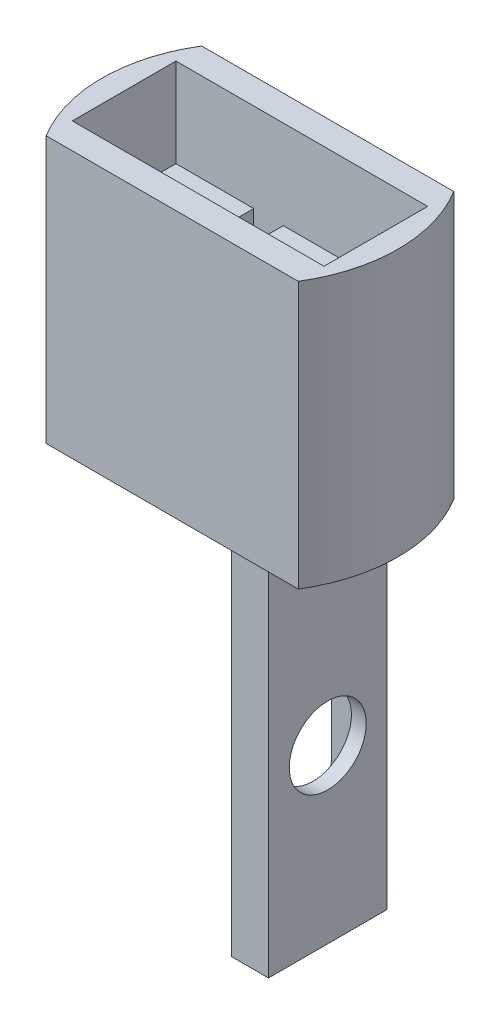
ISO-10303-21;
HEADER;
FILE_DESCRIPTION(('STEP AP214'),'2;1');
FILE_NAME('part.step','',(''),(''),'','','');
FILE_SCHEMA(('AUTOMOTIVE_DESIGN { 1 0 10303 214 1 1 1 1 }'));
ENDSEC;
DATA;
#1=APPLICATION_CONTEXT('core data for automotive mechanical design processes');
#2=APPLICATION_PROTOCOL_DEFINITION('international standard','automotive_design',2000,#1);
#3=PRODUCT_CONTEXT('',#1,'mechanical');
#4=PRODUCT('Part','Part','',(#3));
#5=PRODUCT_RELATED_PRODUCT_CATEGORY('part','',(#4));
#6=PRODUCT_DEFINITION_FORMATION('','',#4);
#7=PRODUCT_DEFINITION_CONTEXT('part definition',#1,'design');
#8=PRODUCT_DEFINITION('design','',#6,#7);
#9=PRODUCT_DEFINITION_SHAPE('','',#8);
#10=(LENGTH_UNIT() NAMED_UNIT(*) SI_UNIT(.MILLI.,.METRE.));
#11=(NAMED_UNIT(*) PLANE_ANGLE_UNIT() SI_UNIT($,.RADIAN.));
#12=(NAMED_UNIT(*) SI_UNIT($,.STERADIAN.) SOLID_ANGLE_UNIT());
#13=UNCERTAINTY_MEASURE_WITH_UNIT(LENGTH_MEASURE(1.E-05),#10,'distance_accuracy_value','');
#14=(GEOMETRIC_REPRESENTATION_CONTEXT(3) GLOBAL_UNCERTAINTY_ASSIGNED_CONTEXT((#13)) GLOBAL_UNIT_ASSIGNED_CONTEXT((#10,
#11,#12)) REPRESENTATION_CONTEXT('',''));
#15=CARTESIAN_POINT('',(0.,0.,0.));
#16=DIRECTION('',(0.,0.,1.));
#17=DIRECTION('',(1.,0.,0.));
#18=AXIS2_PLACEMENT_3D('',#15,#16,#17);
#19=CARTESIAN_POINT('',(0.,18.,0.));
#20=DIRECTION('',(0.,-1.,0.));
#21=DIRECTION('',(0.,0.,-1.));
#22=AXIS2_PLACEMENT_3D('',#19,#20,#21);
#23=CYLINDRICAL_SURFACE('',#22,10.);
#24=CARTESIAN_POINT('',(0.,18.,0.));
#25=DIRECTION('',(0.,1.,0.));
#26=DIRECTION('',(0.,0.,1.));
#27=AXIS2_PLACEMENT_3D('',#24,#25,#26);
#28=CIRCLE('',#27,10.);
#29=CARTESIAN_POINT('',(-8.5110222652746,18.,-5.25));
#30=VERTEX_POINT('',#29);
#31=CARTESIAN_POINT('',(-8.5110222652746,18.,5.25));
#32=VERTEX_POINT('',#31);
#33=EDGE_CURVE('E49',#30,#32,#28,.T.);
#34=ORIENTED_EDGE('',*,*,#33,.F.);
#35=DIRECTION('',(0.,-1.,0.));
#36=VECTOR('',#35,1.);
#37=CARTESIAN_POINT('',(-8.5110222652746,18.001,-5.25));
#38=LINE('',#37,#36);
#39=CARTESIAN_POINT('',(-8.5110222652746,0.,-5.25));
#40=VERTEX_POINT('',#39);
#41=EDGE_CURVE('E57',#30,#40,#38,.T.);
#42=ORIENTED_EDGE('',*,*,#41,.T.);
#43=CARTESIAN_POINT('',(0.,0.,0.));
#44=DIRECTION('',(0.,1.,0.));
#45=DIRECTION('',(0.,0.,1.));
#46=AXIS2_PLACEMENT_3D('',#43,#44,#45);
#47=CIRCLE('',#46,10.);
#48=CARTESIAN_POINT('',(-8.5110222652746,0.,5.25));
#49=VERTEX_POINT('',#48);
#50=EDGE_CURVE('E449',#40,#49,#47,.T.);
#51=ORIENTED_EDGE('',*,*,#50,.T.);
#52=DIRECTION('',(0.,-1.,0.));
#53=VECTOR('',#52,1.);
#54=CARTESIAN_POINT('',(-8.5110222652746,18.001,5.25));
#55=LINE('',#54,#53);
#56=EDGE_CURVE('E228',#32,#49,#55,.T.);
#57=ORIENTED_EDGE('',*,*,#56,.F.);
#58=EDGE_LOOP('',(#34,#42,#51,#57));
#59=FACE_BOUND('',#58,.T.);
#60=ADVANCED_FACE('F39',(#59),#23,.T.);
#61=CARTESIAN_POINT('',(4.25,0.,0.));
#62=DIRECTION('',(1.,0.,0.));
#63=DIRECTION('',(0.,0.,-1.));
#64=AXIS2_PLACEMENT_3D('',#61,#62,#63);
#65=PLANE('',#64);
#66=CARTESIAN_POINT('',(4.25,-13.4,0.));
#67=DIRECTION('',(1.,0.,0.));
#68=DIRECTION('',(0.,0.,-1.));
#69=AXIS2_PLACEMENT_3D('',#66,#67,#68);
#70=CIRCLE('',#69,2.6);
#71=CARTESIAN_POINT('',(4.25,-13.4,-2.6));
#72=VERTEX_POINT('',#71);
#73=EDGE_CURVE('E43',#72,#72,#70,.F.);
#74=ORIENTED_EDGE('',*,*,#73,.F.);
#75=EDGE_LOOP('',(#74));
#76=FACE_BOUND('',#75,.T.);
#77=DIRECTION('',(0.,0.984427575508482,0.175790638483658));
#78=VECTOR('',#77,1.);
#79=CARTESIAN_POINT('',(4.25,-9.9,-2.75));
#80=LINE('',#79,#78);
#81=CARTESIAN_POINT('',(4.25,-9.89999999999999,-2.75));
#82=VERTEX_POINT('',#81);
#83=CARTESIAN_POINT('',(4.25,-2.9,-1.5));
#84=VERTEX_POINT('',#83);
#85=EDGE_CURVE('E209',#82,#84,#80,.T.);
#86=ORIENTED_EDGE('',*,*,#85,.F.);
#87=DIRECTION('',(0.,-1.,0.));
#88=VECTOR('',#87,1.);
#89=CARTESIAN_POINT('',(4.25,-23.9,-2.75));
#90=LINE('',#89,#88);
#91=CARTESIAN_POINT('',(4.25,-16.9,-2.75));
#92=VERTEX_POINT('',#91);
#93=EDGE_CURVE('E384',#82,#92,#90,.T.);
#94=ORIENTED_EDGE('',*,*,#93,.T.);
#95=DIRECTION('',(0.,0.984427575508482,-0.175790638483658));
#96=VECTOR('',#95,1.);
#97=CARTESIAN_POINT('',(4.25,-16.9,-2.75));
#98=LINE('',#97,#96);
#99=CARTESIAN_POINT('',(4.25,-23.9,-1.5));
#100=VERTEX_POINT('',#99);
#101=EDGE_CURVE('E266',#100,#92,#98,.T.);
#102=ORIENTED_EDGE('',*,*,#101,.F.);
#103=DIRECTION('',(0.,0.,1.));
#104=VECTOR('',#103,1.);
#105=CARTESIAN_POINT('',(4.25,-23.9,-2.75));
#106=LINE('',#105,#104);
#107=CARTESIAN_POINT('',(4.25,-23.9,1.5));
#108=VERTEX_POINT('',#107);
#109=EDGE_CURVE('E387',#100,#108,#106,.T.);
#110=ORIENTED_EDGE('',*,*,#109,.T.);
#111=DIRECTION('',(0.,-0.984427575508482,-0.175790638483658));
#112=VECTOR('',#111,1.);
#113=CARTESIAN_POINT('',(4.25,-16.9,2.75));
#114=LINE('',#113,#112);
#115=CARTESIAN_POINT('',(4.25,-16.9,2.75));
#116=VERTEX_POINT('',#115);
#117=EDGE_CURVE('E251',#116,#108,#114,.T.);
#118=ORIENTED_EDGE('',*,*,#117,.F.);
#119=DIRECTION('',(0.,1.,0.));
#120=VECTOR('',#119,1.);
#121=CARTESIAN_POINT('',(4.25,-23.9,2.75));
#122=LINE('',#121,#120);
#123=CARTESIAN_POINT('',(4.25,-9.89999999999999,2.75));
#124=VERTEX_POINT('',#123);
#125=EDGE_CURVE('E375',#116,#124,#122,.T.);
#126=ORIENTED_EDGE('',*,*,#125,.T.);
#127=DIRECTION('',(0.,-0.984427575508482,0.175790638483658));
#128=VECTOR('',#127,1.);
#129=CARTESIAN_POINT('',(4.25,-9.9,2.75));
#130=LINE('',#129,#128);
#131=CARTESIAN_POINT('',(4.25,-2.9,1.5));
#132=VERTEX_POINT('',#131);
#133=EDGE_CURVE('E236',#132,#124,#130,.T.);
#134=ORIENTED_EDGE('',*,*,#133,.F.);
#135=DIRECTION('',(0.,0.,-1.));
#136=VECTOR('',#135,1.);
#137=CARTESIAN_POINT('',(4.25,-2.9,-2.75));
#138=LINE('',#137,#136);
#139=EDGE_CURVE('E379',#132,#84,#138,.T.);
#140=ORIENTED_EDGE('',*,*,#139,.T.);
#141=EDGE_LOOP('',(#86,#94,#102,#110,#118,#126,#134,#140));
#142=FACE_BOUND('',#141,.T.);
#143=ADVANCED_FACE('F475',(#76,#142),#65,.F.);
#144=CARTESIAN_POINT('',(4.25,-2.9,-2.75));
#145=DIRECTION('',(0.,1.,0.));
#146=DIRECTION('',(0.,0.,1.));
#147=AXIS2_PLACEMENT_3D('',#144,#145,#146);
#148=PLANE('',#147);
#149=DIRECTION('',(1.,0.,0.));
#150=VECTOR('',#149,1.);
#151=CARTESIAN_POINT('',(-4.36073132666395,-2.9,-1.5));
#152=LINE('',#151,#150);
#153=CARTESIAN_POINT('',(2.75,-2.9,-1.5));
#154=VERTEX_POINT('',#153);
#155=EDGE_CURVE('E237',#154,#84,#152,.T.);
#156=ORIENTED_EDGE('',*,*,#155,.T.);
#157=ORIENTED_EDGE('',*,*,#139,.F.);
#158=DIRECTION('',(1.,0.,0.));
#159=VECTOR('',#158,1.);
#160=CARTESIAN_POINT('',(-4.36073132666395,-2.9,1.5));
#161=LINE('',#160,#159);
#162=CARTESIAN_POINT('',(2.75,-2.9,1.5));
#163=VERTEX_POINT('',#162);
#164=EDGE_CURVE('E252',#163,#132,#161,.T.);
#165=ORIENTED_EDGE('',*,*,#164,.F.);
#166=DIRECTION('',(0.,0.,-1.));
#167=VECTOR('',#166,1.);
#168=CARTESIAN_POINT('',(2.75,-2.9,-2.75));
#169=LINE('',#168,#167);
#170=EDGE_CURVE('E393',#163,#154,#169,.T.);
#171=ORIENTED_EDGE('',*,*,#170,.T.);
#172=EDGE_LOOP('',(#156,#157,#165,#171));
#173=FACE_BOUND('',#172,.T.);
#174=ADVANCED_FACE('F478',(#173),#148,.F.);
#175=CARTESIAN_POINT('',(4.25,-23.9,-2.75));
#176=DIRECTION('',(0.,0.,-1.));
#177=DIRECTION('',(-1.,0.,0.));
#178=AXIS2_PLACEMENT_3D('',#175,#176,#177);
#179=PLANE('',#178);
#180=DIRECTION('',(1.,0.,0.));
#181=VECTOR('',#180,1.);
#182=CARTESIAN_POINT('',(-4.36073132666394,-9.9,-2.75));
#183=LINE('',#182,#181);
#184=CARTESIAN_POINT('',(2.75,-9.89999999999999,-2.75));
#185=VERTEX_POINT('',#184);
#186=EDGE_CURVE('E241',#185,#82,#183,.T.);
#187=ORIENTED_EDGE('',*,*,#186,.F.);
#188=DIRECTION('',(0.,-1.,0.));
#189=VECTOR('',#188,1.);
#190=CARTESIAN_POINT('',(2.75,-23.9,-2.75));
#191=LINE('',#190,#189);
#192=CARTESIAN_POINT('',(2.75,-16.9,-2.75));
#193=VERTEX_POINT('',#192);
#194=EDGE_CURVE('E396',#185,#193,#191,.T.);
#195=ORIENTED_EDGE('',*,*,#194,.T.);
#196=DIRECTION('',(1.,0.,0.));
#197=VECTOR('',#196,1.);
#198=CARTESIAN_POINT('',(-4.36073132666394,-16.9,-2.75));
#199=LINE('',#198,#197);
#200=EDGE_CURVE('E286',#193,#92,#199,.T.);
#201=ORIENTED_EDGE('',*,*,#200,.T.);
#202=ORIENTED_EDGE('',*,*,#93,.F.);
#203=EDGE_LOOP('',(#187,#195,#201,#202));
#204=FACE_BOUND('',#203,.T.);
#205=ADVANCED_FACE('F485',(#204),#179,.F.);
#206=CARTESIAN_POINT('',(4.25,-23.9,2.75));
#207=DIRECTION('',(0.,0.,1.));
#208=DIRECTION('',(1.,0.,0.));
#209=AXIS2_PLACEMENT_3D('',#206,#207,#208);
#210=PLANE('',#209);
#211=DIRECTION('',(1.,0.,0.));
#212=VECTOR('',#211,1.);
#213=CARTESIAN_POINT('',(-4.36073132666395,-9.9,2.75));
#214=LINE('',#213,#212);
#215=CARTESIAN_POINT('',(2.75,-9.89999999999998,2.75));
#216=VERTEX_POINT('',#215);
#217=EDGE_CURVE('E256',#216,#124,#214,.T.);
#218=ORIENTED_EDGE('',*,*,#217,.T.);
#219=ORIENTED_EDGE('',*,*,#125,.F.);
#220=DIRECTION('',(1.,0.,0.));
#221=VECTOR('',#220,1.);
#222=CARTESIAN_POINT('',(-4.36073132666395,-16.9,2.75));
#223=LINE('',#222,#221);
#224=CARTESIAN_POINT('',(2.75,-16.9,2.75));
#225=VERTEX_POINT('',#224);
#226=EDGE_CURVE('E271',#225,#116,#223,.T.);
#227=ORIENTED_EDGE('',*,*,#226,.F.);
#228=DIRECTION('',(0.,1.,0.));
#229=VECTOR('',#228,1.);
#230=CARTESIAN_POINT('',(2.75,-23.9,2.75));
#231=LINE('',#230,#229);
#232=EDGE_CURVE('E365',#225,#216,#231,.T.);
#233=ORIENTED_EDGE('',*,*,#232,.T.);
#234=EDGE_LOOP('',(#218,#219,#227,#233));
#235=FACE_BOUND('',#234,.T.);
#236=ADVANCED_FACE('F509',(#235),#210,.F.);
#237=CARTESIAN_POINT('',(4.25,-23.9,-2.75));
#238=DIRECTION('',(0.,-1.,0.));
#239=DIRECTION('',(0.,0.,-1.));
#240=AXIS2_PLACEMENT_3D('',#237,#238,#239);
#241=PLANE('',#240);
#242=DIRECTION('',(1.,0.,0.));
#243=VECTOR('',#242,1.);
#244=CARTESIAN_POINT('',(-4.36073132666395,-23.9,1.5));
#245=LINE('',#244,#243);
#246=CARTESIAN_POINT('',(2.75,-23.9,1.5));
#247=VERTEX_POINT('',#246);
#248=EDGE_CURVE('E267',#247,#108,#245,.T.);
#249=ORIENTED_EDGE('',*,*,#248,.T.);
#250=ORIENTED_EDGE('',*,*,#109,.F.);
#251=DIRECTION('',(1.,0.,0.));
#252=VECTOR('',#251,1.);
#253=CARTESIAN_POINT('',(-4.36073132666395,-23.9,-1.5));
#254=LINE('',#253,#252);
#255=CARTESIAN_POINT('',(2.75,-23.9,-1.5));
#256=VERTEX_POINT('',#255);
#257=EDGE_CURVE('E282',#256,#100,#254,.T.);
#258=ORIENTED_EDGE('',*,*,#257,.F.);
#259=DIRECTION('',(0.,0.,1.));
#260=VECTOR('',#259,1.);
#261=CARTESIAN_POINT('',(2.75,-23.9,-2.75));
#262=LINE('',#261,#260);
#263=EDGE_CURVE('E380',#256,#247,#262,.T.);
#264=ORIENTED_EDGE('',*,*,#263,.T.);
#265=EDGE_LOOP('',(#249,#250,#258,#264));
#266=FACE_BOUND('',#265,.T.);
#267=ADVANCED_FACE('F502',(#266),#241,.F.);
#268=CARTESIAN_POINT('',(0.,12.,0.));
#269=DIRECTION('',(0.,-1.,0.));
#270=DIRECTION('',(0.,0.,-1.));
#271=AXIS2_PLACEMENT_3D('',#268,#269,#270);
#272=PLANE('',#271);
#273=DIRECTION('',(0.,0.,-1.));
#274=VECTOR('',#273,1.);
#275=CARTESIAN_POINT('',(-1.25,12.,-3.5));
#276=LINE('',#275,#274);
#277=CARTESIAN_POINT('',(-1.25,12.,3.5));
#278=VERTEX_POINT('',#277);
#279=CARTESIAN_POINT('',(-1.25,12.,-3.5));
#280=VERTEX_POINT('',#279);
#281=EDGE_CURVE('E281',#278,#280,#276,.T.);
#282=ORIENTED_EDGE('',*,*,#281,.F.);
#283=DIRECTION('',(1.,0.,0.));
#284=VECTOR('',#283,1.);
#285=CARTESIAN_POINT('',(-8.5,12.,3.5));
#286=LINE('',#285,#284);
#287=CARTESIAN_POINT('',(8.5,12.,3.5));
#288=VERTEX_POINT('',#287);
#289=EDGE_CURVE('E333',#278,#288,#286,.T.);
#290=ORIENTED_EDGE('',*,*,#289,.T.);
#291=DIRECTION('',(0.,0.,-1.));
#292=VECTOR('',#291,1.);
#293=CARTESIAN_POINT('',(8.5,12.,3.5));
#294=LINE('',#293,#292);
#295=CARTESIAN_POINT('',(8.5,12.,-3.5));
#296=VERTEX_POINT('',#295);
#297=EDGE_CURVE('E339',#288,#296,#294,.T.);
#298=ORIENTED_EDGE('',*,*,#297,.T.);
#299=DIRECTION('',(-1.,0.,0.));
#300=VECTOR('',#299,1.);
#301=CARTESIAN_POINT('',(-8.5,12.,-3.5));
#302=LINE('',#301,#300);
#303=EDGE_CURVE('E344',#296,#280,#302,.T.);
#304=ORIENTED_EDGE('',*,*,#303,.T.);
#305=EDGE_LOOP('',(#282,#290,#298,#304));
#306=FACE_BOUND('',#305,.T.);
#307=ADVANCED_FACE('F535',(#306),#272,.F.);
#308=DIRECTION('',(0.,0.,1.));
#309=VECTOR('',#308,1.);
#310=CARTESIAN_POINT('',(-3.25,12.,-3.5));
#311=LINE('',#310,#309);
#312=CARTESIAN_POINT('',(-3.25,12.,-3.5));
#313=VERTEX_POINT('',#312);
#314=CARTESIAN_POINT('',(-3.25,12.,3.5));
#315=VERTEX_POINT('',#314);
#316=EDGE_CURVE('E298',#313,#315,#311,.T.);
#317=ORIENTED_EDGE('',*,*,#316,.F.);
#318=CARTESIAN_POINT('',(-8.5,12.,-3.5));
#319=VERTEX_POINT('',#318);
#320=EDGE_CURVE('E343',#313,#319,#302,.T.);
#321=ORIENTED_EDGE('',*,*,#320,.T.);
#322=DIRECTION('',(0.,0.,1.));
#323=VECTOR('',#322,1.);
#324=CARTESIAN_POINT('',(-8.5,12.,3.5));
#325=LINE('',#324,#323);
#326=CARTESIAN_POINT('',(-8.5,12.,3.5));
#327=VERTEX_POINT('',#326);
#328=EDGE_CURVE('E329',#319,#327,#325,.T.);
#329=ORIENTED_EDGE('',*,*,#328,.T.);
#330=EDGE_CURVE('E335',#327,#315,#286,.T.);
#331=ORIENTED_EDGE('',*,*,#330,.T.);
#332=EDGE_LOOP('',(#317,#321,#329,#331));
#333=FACE_BOUND('',#332,.T.);
#334=ADVANCED_FACE('F531',(#333),#272,.F.);
#335=CARTESIAN_POINT('',(0.,0.,0.));
#336=DIRECTION('',(0.,1.,0.));
#337=DIRECTION('',(0.,0.,1.));
#338=AXIS2_PLACEMENT_3D('',#335,#336,#337);
#339=PLANE('',#338);
#340=ORIENTED_EDGE('',*,*,#50,.F.);
#341=DIRECTION('',(-1.,0.,0.));
#342=VECTOR('',#341,1.);
#343=CARTESIAN_POINT('',(-8.5110222652746,0.,-5.25));
#344=LINE('',#343,#342);
#345=CARTESIAN_POINT('',(8.5110222652746,0.,-5.25));
#346=VERTEX_POINT('',#345);
#347=EDGE_CURVE('E217',#346,#40,#344,.T.);
#348=ORIENTED_EDGE('',*,*,#347,.F.);
#349=CARTESIAN_POINT('',(8.5110222652746,0.,5.25));
#350=VERTEX_POINT('',#349);
#351=EDGE_CURVE('E215',#350,#346,#47,.T.);
#352=ORIENTED_EDGE('',*,*,#351,.F.);
#353=DIRECTION('',(1.,0.,0.));
#354=VECTOR('',#353,1.);
#355=CARTESIAN_POINT('',(-8.5110222652746,0.,5.25));
#356=LINE('',#355,#354);
#357=EDGE_CURVE('E460',#49,#350,#356,.T.);
#358=ORIENTED_EDGE('',*,*,#357,.F.);
#359=EDGE_LOOP('',(#340,#348,#352,#358));
#360=FACE_BOUND('',#359,.T.);
#361=DIRECTION('',(0.,0.,1.));
#362=VECTOR('',#361,1.);
#363=CARTESIAN_POINT('',(5.25,0.,-4.));
#364=LINE('',#363,#362);
#365=CARTESIAN_POINT('',(5.25,0.,-4.));
#366=VERTEX_POINT('',#365);
#367=CARTESIAN_POINT('',(5.25,0.,4.));
#368=VERTEX_POINT('',#367);
#369=EDGE_CURVE('E405',#366,#368,#364,.T.);
#370=ORIENTED_EDGE('',*,*,#369,.F.);
#371=DIRECTION('',(1.,0.,0.));
#372=VECTOR('',#371,1.);
#373=CARTESIAN_POINT('',(2.75,0.,-4.));
#374=LINE('',#373,#372);
#375=CARTESIAN_POINT('',(2.75,0.,-4.));
#376=VERTEX_POINT('',#375);
#377=EDGE_CURVE('E411',#376,#366,#374,.T.);
#378=ORIENTED_EDGE('',*,*,#377,.F.);
#379=DIRECTION('',(0.,0.,-1.));
#380=VECTOR('',#379,1.);
#381=CARTESIAN_POINT('',(2.75,0.,-4.));
#382=LINE('',#381,#380);
#383=CARTESIAN_POINT('',(2.75,0.,4.));
#384=VERTEX_POINT('',#383);
#385=EDGE_CURVE('E428',#384,#376,#382,.T.);
#386=ORIENTED_EDGE('',*,*,#385,.F.);
#387=DIRECTION('',(-1.,0.,0.));
#388=VECTOR('',#387,1.);
#389=CARTESIAN_POINT('',(2.75,0.,4.));
#390=LINE('',#389,#388);
#391=EDGE_CURVE('E424',#368,#384,#390,.T.);
#392=ORIENTED_EDGE('',*,*,#391,.F.);
#393=EDGE_LOOP('',(#370,#378,#386,#392));
#394=FACE_BOUND('',#393,.T.);
#395=ADVANCED_FACE('F458',(#360,#394),#339,.F.);
#396=ORIENTED_EDGE('',*,*,#351,.T.);
#397=DIRECTION('',(0.,-1.,0.));
#398=VECTOR('',#397,1.);
#399=CARTESIAN_POINT('',(8.5110222652746,18.001,-5.25));
#400=LINE('',#399,#398);
#401=CARTESIAN_POINT('',(8.5110222652746,18.,-5.25));
#402=VERTEX_POINT('',#401);
#403=EDGE_CURVE('E203',#402,#346,#400,.T.);
#404=ORIENTED_EDGE('',*,*,#403,.F.);
#405=CARTESIAN_POINT('',(8.5110222652746,18.,5.25));
#406=VERTEX_POINT('',#405);
#407=EDGE_CURVE('E11',#406,#402,#28,.T.);
#408=ORIENTED_EDGE('',*,*,#407,.F.);
#409=DIRECTION('',(0.,-1.,0.));
#410=VECTOR('',#409,1.);
#411=CARTESIAN_POINT('',(8.5110222652746,18.001,5.25));
#412=LINE('',#411,#410);
#413=EDGE_CURVE('E65',#406,#350,#412,.T.);
#414=ORIENTED_EDGE('',*,*,#413,.T.);
#415=EDGE_LOOP('',(#396,#404,#408,#414));
#416=FACE_BOUND('',#415,.T.);
#417=ADVANCED_FACE('F41',(#416),#23,.T.);
#418=CARTESIAN_POINT('',(0.,18.,0.));
#419=DIRECTION('',(0.,1.,0.));
#420=DIRECTION('',(0.,0.,1.));
#421=AXIS2_PLACEMENT_3D('',#418,#419,#420);
#422=PLANE('',#421);
#423=DIRECTION('',(-1.,0.,0.));
#424=VECTOR('',#423,1.);
#425=CARTESIAN_POINT('',(-8.5110222652746,18.,-5.25));
#426=LINE('',#425,#424);
#427=EDGE_CURVE('E200',#402,#30,#426,.T.);
#428=ORIENTED_EDGE('',*,*,#427,.T.);
#429=ORIENTED_EDGE('',*,*,#33,.T.);
#430=DIRECTION('',(1.,0.,0.));
#431=VECTOR('',#430,1.);
#432=CARTESIAN_POINT('',(-8.5110222652746,18.,5.25));
#433=LINE('',#432,#431);
#434=EDGE_CURVE('E221',#32,#406,#433,.T.);
#435=ORIENTED_EDGE('',*,*,#434,.T.);
#436=ORIENTED_EDGE('',*,*,#407,.T.);
#437=EDGE_LOOP('',(#428,#429,#435,#436));
#438=FACE_BOUND('',#437,.T.);
#439=DIRECTION('',(0.,0.,1.));
#440=VECTOR('',#439,1.);
#441=CARTESIAN_POINT('',(-8.5,18.,3.5));
#442=LINE('',#441,#440);
#443=CARTESIAN_POINT('',(-8.5,18.,-3.5));
#444=VERTEX_POINT('',#443);
#445=CARTESIAN_POINT('',(-8.5,18.,3.5));
#446=VERTEX_POINT('',#445);
#447=EDGE_CURVE('E320',#444,#446,#442,.T.);
#448=ORIENTED_EDGE('',*,*,#447,.F.);
#449=DIRECTION('',(-1.,0.,0.));
#450=VECTOR('',#449,1.);
#451=CARTESIAN_POINT('',(-8.5,18.,-3.5));
#452=LINE('',#451,#450);
#453=CARTESIAN_POINT('',(8.5,18.,-3.5));
#454=VERTEX_POINT('',#453);
#455=EDGE_CURVE('E334',#454,#444,#452,.T.);
#456=ORIENTED_EDGE('',*,*,#455,.F.);
#457=DIRECTION('',(0.,0.,-1.));
#458=VECTOR('',#457,1.);
#459=CARTESIAN_POINT('',(8.5,18.,3.5));
#460=LINE('',#459,#458);
#461=CARTESIAN_POINT('',(8.5,18.,3.5));
#462=VERTEX_POINT('',#461);
#463=EDGE_CURVE('E355',#462,#454,#460,.T.);
#464=ORIENTED_EDGE('',*,*,#463,.F.);
#465=DIRECTION('',(1.,0.,0.));
#466=VECTOR('',#465,1.);
#467=CARTESIAN_POINT('',(-8.5,18.,3.5));
#468=LINE('',#467,#466);
#469=EDGE_CURVE('E351',#446,#462,#468,.T.);
#470=ORIENTED_EDGE('',*,*,#469,.F.);
#471=EDGE_LOOP('',(#448,#456,#464,#470));
#472=FACE_BOUND('',#471,.T.);
#473=ADVANCED_FACE('F219',(#438,#472),#422,.T.);
#474=CARTESIAN_POINT('',(5.25,-25.,-4.));
#475=DIRECTION('',(-1.,0.,0.));
#476=DIRECTION('',(0.,0.,1.));
#477=AXIS2_PLACEMENT_3D('',#474,#475,#476);
#478=PLANE('',#477);
#479=CARTESIAN_POINT('',(5.25,-13.4,0.));
#480=DIRECTION('',(1.,0.,0.));
#481=DIRECTION('',(0.,0.,-1.));
#482=AXIS2_PLACEMENT_3D('',#479,#480,#481);
#483=CIRCLE('',#482,2.6);
#484=CARTESIAN_POINT('',(5.25,-13.4,-2.6));
#485=VERTEX_POINT('',#484);
#486=EDGE_CURVE('E401',#485,#485,#483,.T.);
#487=ORIENTED_EDGE('',*,*,#486,.F.);
#488=EDGE_LOOP('',(#487));
#489=FACE_BOUND('',#488,.T.);
#490=ORIENTED_EDGE('',*,*,#369,.T.);
#491=DIRECTION('',(0.,1.,0.));
#492=VECTOR('',#491,1.);
#493=CARTESIAN_POINT('',(5.25,-25.,4.));
#494=LINE('',#493,#492);
#495=CARTESIAN_POINT('',(5.25,-25.,4.));
#496=VERTEX_POINT('',#495);
#497=EDGE_CURVE('E446',#496,#368,#494,.T.);
#498=ORIENTED_EDGE('',*,*,#497,.F.);
#499=DIRECTION('',(0.,0.,1.));
#500=VECTOR('',#499,1.);
#501=CARTESIAN_POINT('',(5.25,-25.,-4.));
#502=LINE('',#501,#500);
#503=CARTESIAN_POINT('',(5.25,-25.,-4.));
#504=VERTEX_POINT('',#503);
#505=EDGE_CURVE('E406',#504,#496,#502,.T.);
#506=ORIENTED_EDGE('',*,*,#505,.F.);
#507=DIRECTION('',(0.,1.,0.));
#508=VECTOR('',#507,1.);
#509=CARTESIAN_POINT('',(5.25,-25.,-4.));
#510=LINE('',#509,#508);
#511=EDGE_CURVE('E420',#504,#366,#510,.T.);
#512=ORIENTED_EDGE('',*,*,#511,.T.);
#513=EDGE_LOOP('',(#490,#498,#506,#512));
#514=FACE_BOUND('',#513,.T.);
#515=ADVANCED_FACE('F529',(#489,#514),#478,.F.);
#516=CARTESIAN_POINT('',(2.75,-25.,4.));
#517=DIRECTION('',(0.,0.,-1.));
#518=DIRECTION('',(-1.,0.,0.));
#519=AXIS2_PLACEMENT_3D('',#516,#517,#518);
#520=PLANE('',#519);
#521=ORIENTED_EDGE('',*,*,#391,.T.);
#522=DIRECTION('',(0.,1.,0.));
#523=VECTOR('',#522,1.);
#524=CARTESIAN_POINT('',(2.75,-25.,4.));
#525=LINE('',#524,#523);
#526=CARTESIAN_POINT('',(2.75,-25.,4.));
#527=VERTEX_POINT('',#526);
#528=EDGE_CURVE('E442',#527,#384,#525,.T.);
#529=ORIENTED_EDGE('',*,*,#528,.F.);
#530=DIRECTION('',(-1.,0.,0.));
#531=VECTOR('',#530,1.);
#532=CARTESIAN_POINT('',(2.75,-25.,4.));
#533=LINE('',#532,#531);
#534=EDGE_CURVE('E410',#496,#527,#533,.T.);
#535=ORIENTED_EDGE('',*,*,#534,.F.);
#536=ORIENTED_EDGE('',*,*,#497,.T.);
#537=EDGE_LOOP('',(#521,#529,#535,#536));
#538=FACE_BOUND('',#537,.T.);
#539=ADVANCED_FACE('F541',(#538),#520,.F.);
#540=CARTESIAN_POINT('',(2.75,-25.,-4.));
#541=DIRECTION('',(1.,0.,0.));
#542=DIRECTION('',(0.,0.,-1.));
#543=AXIS2_PLACEMENT_3D('',#540,#541,#542);
#544=PLANE('',#543);
#545=ORIENTED_EDGE('',*,*,#194,.F.);
#546=DIRECTION('',(0.,-0.984427575508482,-0.175790638483658));
#547=VECTOR('',#546,1.);
#548=CARTESIAN_POINT('',(2.75,-9.9,-2.75));
#549=LINE('',#548,#547);
#550=EDGE_CURVE('E232',#154,#185,#549,.T.);
#551=ORIENTED_EDGE('',*,*,#550,.F.);
#552=ORIENTED_EDGE('',*,*,#170,.F.);
#553=DIRECTION('',(0.,0.984427575508482,-0.175790638483658));
#554=VECTOR('',#553,1.);
#555=CARTESIAN_POINT('',(2.75,-9.9,2.75));
#556=LINE('',#555,#554);
#557=EDGE_CURVE('E247',#216,#163,#556,.T.);
#558=ORIENTED_EDGE('',*,*,#557,.F.);
#559=ORIENTED_EDGE('',*,*,#232,.F.);
#560=DIRECTION('',(0.,0.984427575508482,0.175790638483658));
#561=VECTOR('',#560,1.);
#562=CARTESIAN_POINT('',(2.75,-16.9,2.75));
#563=LINE('',#562,#561);
#564=EDGE_CURVE('E262',#247,#225,#563,.T.);
#565=ORIENTED_EDGE('',*,*,#564,.F.);
#566=ORIENTED_EDGE('',*,*,#263,.F.);
#567=DIRECTION('',(0.,-0.984427575508482,0.175790638483658));
#568=VECTOR('',#567,1.);
#569=CARTESIAN_POINT('',(2.75,-16.9,-2.75));
#570=LINE('',#569,#568);
#571=EDGE_CURVE('E277',#193,#256,#570,.T.);
#572=ORIENTED_EDGE('',*,*,#571,.F.);
#573=EDGE_LOOP('',(#545,#551,#552,#558,#559,#565,#566,#572));
#574=FACE_BOUND('',#573,.T.);
#575=ORIENTED_EDGE('',*,*,#385,.T.);
#576=DIRECTION('',(0.,1.,0.));
#577=VECTOR('',#576,1.);
#578=CARTESIAN_POINT('',(2.75,-25.,-4.));
#579=LINE('',#578,#577);
#580=CARTESIAN_POINT('',(2.75,-25.,-4.));
#581=VERTEX_POINT('',#580);
#582=EDGE_CURVE('E438',#581,#376,#579,.T.);
#583=ORIENTED_EDGE('',*,*,#582,.F.);
#584=DIRECTION('',(0.,0.,-1.));
#585=VECTOR('',#584,1.);
#586=CARTESIAN_POINT('',(2.75,-25.,-4.));
#587=LINE('',#586,#585);
#588=EDGE_CURVE('E414',#527,#581,#587,.T.);
#589=ORIENTED_EDGE('',*,*,#588,.F.);
#590=ORIENTED_EDGE('',*,*,#528,.T.);
#591=EDGE_LOOP('',(#575,#583,#589,#590));
#592=FACE_BOUND('',#591,.T.);
#593=ADVANCED_FACE('F491',(#574,#592),#544,.F.);
#594=CARTESIAN_POINT('',(2.75,-25.,-4.));
#595=DIRECTION('',(0.,0.,1.));
#596=DIRECTION('',(1.,0.,0.));
#597=AXIS2_PLACEMENT_3D('',#594,#595,#596);
#598=PLANE('',#597);
#599=ORIENTED_EDGE('',*,*,#377,.T.);
#600=ORIENTED_EDGE('',*,*,#511,.F.);
#601=DIRECTION('',(1.,0.,0.));
#602=VECTOR('',#601,1.);
#603=CARTESIAN_POINT('',(2.75,-25.,-4.));
#604=LINE('',#603,#602);
#605=EDGE_CURVE('E417',#581,#504,#604,.T.);
#606=ORIENTED_EDGE('',*,*,#605,.F.);
#607=ORIENTED_EDGE('',*,*,#582,.T.);
#608=EDGE_LOOP('',(#599,#600,#606,#607));
#609=FACE_BOUND('',#608,.T.);
#610=ADVANCED_FACE('F548',(#609),#598,.F.);
#611=CARTESIAN_POINT('',(0.,-25.,0.));
#612=DIRECTION('',(0.,1.,0.));
#613=DIRECTION('',(0.,0.,1.));
#614=AXIS2_PLACEMENT_3D('',#611,#612,#613);
#615=PLANE('',#614);
#616=ORIENTED_EDGE('',*,*,#505,.T.);
#617=ORIENTED_EDGE('',*,*,#534,.T.);
#618=ORIENTED_EDGE('',*,*,#588,.T.);
#619=ORIENTED_EDGE('',*,*,#605,.T.);
#620=EDGE_LOOP('',(#616,#617,#618,#619));
#621=FACE_BOUND('',#620,.T.);
#622=ADVANCED_FACE('F551',(#621),#615,.F.);
#623=CARTESIAN_POINT('',(-10.001,-13.4,0.));
#624=DIRECTION('',(1.,0.,0.));
#625=DIRECTION('',(0.,0.,-1.));
#626=AXIS2_PLACEMENT_3D('',#623,#624,#625);
#627=CYLINDRICAL_SURFACE('',#626,2.6);
#628=ORIENTED_EDGE('',*,*,#73,.T.);
#629=EDGE_LOOP('',(#628));
#630=FACE_BOUND('',#629,.T.);
#631=ORIENTED_EDGE('',*,*,#486,.T.);
#632=EDGE_LOOP('',(#631));
#633=FACE_BOUND('',#632,.T.);
#634=ADVANCED_FACE('F472',(#630,#633),#627,.F.);
#635=CARTESIAN_POINT('',(-8.5,12.,3.5));
#636=DIRECTION('',(-1.,0.,0.));
#637=DIRECTION('',(0.,0.,1.));
#638=AXIS2_PLACEMENT_3D('',#635,#636,#637);
#639=PLANE('',#638);
#640=ORIENTED_EDGE('',*,*,#447,.T.);
#641=DIRECTION('',(0.,1.,0.));
#642=VECTOR('',#641,1.);
#643=CARTESIAN_POINT('',(-8.5,12.,3.5));
#644=LINE('',#643,#642);
#645=EDGE_CURVE('E348',#327,#446,#644,.T.);
#646=ORIENTED_EDGE('',*,*,#645,.F.);
#647=ORIENTED_EDGE('',*,*,#328,.F.);
#648=DIRECTION('',(0.,1.,0.));
#649=VECTOR('',#648,1.);
#650=CARTESIAN_POINT('',(-8.5,12.,-3.5));
#651=LINE('',#650,#649);
#652=EDGE_CURVE('E362',#319,#444,#651,.T.);
#653=ORIENTED_EDGE('',*,*,#652,.T.);
#654=EDGE_LOOP('',(#640,#646,#647,#653));
#655=FACE_BOUND('',#654,.T.);
#656=ADVANCED_FACE('F557',(#655),#639,.F.);
#657=CARTESIAN_POINT('',(-8.5,12.,-3.5));
#658=DIRECTION('',(0.,0.,-1.));
#659=DIRECTION('',(-1.,0.,0.));
#660=AXIS2_PLACEMENT_3D('',#657,#658,#659);
#661=PLANE('',#660);
#662=ORIENTED_EDGE('',*,*,#455,.T.);
#663=ORIENTED_EDGE('',*,*,#652,.F.);
#664=ORIENTED_EDGE('',*,*,#320,.F.);
#665=DIRECTION('',(0.,1.,0.));
#666=VECTOR('',#665,1.);
#667=CARTESIAN_POINT('',(-3.25,8.,-3.5));
#668=LINE('',#667,#666);
#669=CARTESIAN_POINT('',(-3.25,8.,-3.5));
#670=VERTEX_POINT('',#669);
#671=EDGE_CURVE('E324',#670,#313,#668,.T.);
#672=ORIENTED_EDGE('',*,*,#671,.F.);
#673=DIRECTION('',(-1.,0.,0.));
#674=VECTOR('',#673,1.);
#675=CARTESIAN_POINT('',(-1.25,8.,-3.5));
#676=LINE('',#675,#674);
#677=CARTESIAN_POINT('',(-1.25,8.,-3.5));
#678=VERTEX_POINT('',#677);
#679=EDGE_CURVE('E297',#678,#670,#676,.T.);
#680=ORIENTED_EDGE('',*,*,#679,.F.);
#681=DIRECTION('',(0.,1.,0.));
#682=VECTOR('',#681,1.);
#683=CARTESIAN_POINT('',(-1.25,8.,-3.5));
#684=LINE('',#683,#682);
#685=EDGE_CURVE('E310',#678,#280,#684,.T.);
#686=ORIENTED_EDGE('',*,*,#685,.T.);
#687=ORIENTED_EDGE('',*,*,#303,.F.);
#688=DIRECTION('',(0.,1.,0.));
#689=VECTOR('',#688,1.);
#690=CARTESIAN_POINT('',(8.5,12.,-3.5));
#691=LINE('',#690,#689);
#692=EDGE_CURVE('E366',#296,#454,#691,.T.);
#693=ORIENTED_EDGE('',*,*,#692,.T.);
#694=EDGE_LOOP('',(#662,#663,#664,#672,#680,#686,#687,#693));
#695=FACE_BOUND('',#694,.T.);
#696=ADVANCED_FACE('F570',(#695),#661,.F.);
#697=CARTESIAN_POINT('',(8.5,12.,3.5));
#698=DIRECTION('',(1.,0.,0.));
#699=DIRECTION('',(0.,0.,-1.));
#700=AXIS2_PLACEMENT_3D('',#697,#698,#699);
#701=PLANE('',#700);
#702=ORIENTED_EDGE('',*,*,#463,.T.);
#703=ORIENTED_EDGE('',*,*,#692,.F.);
#704=ORIENTED_EDGE('',*,*,#297,.F.);
#705=DIRECTION('',(0.,1.,0.));
#706=VECTOR('',#705,1.);
#707=CARTESIAN_POINT('',(8.5,12.,3.5));
#708=LINE('',#707,#706);
#709=EDGE_CURVE('E369',#288,#462,#708,.T.);
#710=ORIENTED_EDGE('',*,*,#709,.T.);
#711=EDGE_LOOP('',(#702,#703,#704,#710));
#712=FACE_BOUND('',#711,.T.);
#713=ADVANCED_FACE('F576',(#712),#701,.F.);
#714=CARTESIAN_POINT('',(-8.5,12.,3.5));
#715=DIRECTION('',(0.,0.,1.));
#716=DIRECTION('',(1.,0.,0.));
#717=AXIS2_PLACEMENT_3D('',#714,#715,#716);
#718=PLANE('',#717);
#719=ORIENTED_EDGE('',*,*,#469,.T.);
#720=ORIENTED_EDGE('',*,*,#709,.F.);
#721=ORIENTED_EDGE('',*,*,#289,.F.);
#722=DIRECTION('',(0.,1.,0.));
#723=VECTOR('',#722,1.);
#724=CARTESIAN_POINT('',(-1.25,8.,3.5));
#725=LINE('',#724,#723);
#726=CARTESIAN_POINT('',(-1.25,8.,3.5));
#727=VERTEX_POINT('',#726);
#728=EDGE_CURVE('E317',#727,#278,#725,.T.);
#729=ORIENTED_EDGE('',*,*,#728,.F.);
#730=DIRECTION('',(1.,0.,0.));
#731=VECTOR('',#730,1.);
#732=CARTESIAN_POINT('',(-1.25,8.,3.5));
#733=LINE('',#732,#731);
#734=CARTESIAN_POINT('',(-3.25,8.,3.5));
#735=VERTEX_POINT('',#734);
#736=EDGE_CURVE('E306',#735,#727,#733,.T.);
#737=ORIENTED_EDGE('',*,*,#736,.F.);
#738=DIRECTION('',(0.,1.,0.));
#739=VECTOR('',#738,1.);
#740=CARTESIAN_POINT('',(-3.25,8.,3.5));
#741=LINE('',#740,#739);
#742=EDGE_CURVE('E321',#735,#315,#741,.T.);
#743=ORIENTED_EDGE('',*,*,#742,.T.);
#744=ORIENTED_EDGE('',*,*,#330,.F.);
#745=ORIENTED_EDGE('',*,*,#645,.T.);
#746=EDGE_LOOP('',(#719,#720,#721,#729,#737,#743,#744,#745));
#747=FACE_BOUND('',#746,.T.);
#748=ADVANCED_FACE('F572',(#747),#718,.F.);
#749=CARTESIAN_POINT('',(-1.25,8.,-3.5));
#750=DIRECTION('',(1.,0.,0.));
#751=DIRECTION('',(0.,0.,-1.));
#752=AXIS2_PLACEMENT_3D('',#749,#750,#751);
#753=PLANE('',#752);
#754=ORIENTED_EDGE('',*,*,#281,.T.);
#755=ORIENTED_EDGE('',*,*,#685,.F.);
#756=DIRECTION('',(0.,0.,-1.));
#757=VECTOR('',#756,1.);
#758=CARTESIAN_POINT('',(-1.25,8.,-3.5));
#759=LINE('',#758,#757);
#760=EDGE_CURVE('E293',#727,#678,#759,.T.);
#761=ORIENTED_EDGE('',*,*,#760,.F.);
#762=ORIENTED_EDGE('',*,*,#728,.T.);
#763=EDGE_LOOP('',(#754,#755,#761,#762));
#764=FACE_BOUND('',#763,.T.);
#765=ADVANCED_FACE('F575',(#764),#753,.F.);
#766=CARTESIAN_POINT('',(-3.25,8.,-3.5));
#767=DIRECTION('',(-1.,0.,0.));
#768=DIRECTION('',(0.,0.,1.));
#769=AXIS2_PLACEMENT_3D('',#766,#767,#768);
#770=PLANE('',#769);
#771=ORIENTED_EDGE('',*,*,#316,.T.);
#772=ORIENTED_EDGE('',*,*,#742,.F.);
#773=DIRECTION('',(0.,0.,1.));
#774=VECTOR('',#773,1.);
#775=CARTESIAN_POINT('',(-3.25,8.,-3.5));
#776=LINE('',#775,#774);
#777=EDGE_CURVE('E302',#670,#735,#776,.T.);
#778=ORIENTED_EDGE('',*,*,#777,.F.);
#779=ORIENTED_EDGE('',*,*,#671,.T.);
#780=EDGE_LOOP('',(#771,#772,#778,#779));
#781=FACE_BOUND('',#780,.T.);
#782=ADVANCED_FACE('F586',(#781),#770,.F.);
#783=CARTESIAN_POINT('',(0.,8.,0.));
#784=DIRECTION('',(0.,-1.,0.));
#785=DIRECTION('',(0.,0.,-1.));
#786=AXIS2_PLACEMENT_3D('',#783,#784,#785);
#787=PLANE('',#786);
#788=ORIENTED_EDGE('',*,*,#760,.T.);
#789=ORIENTED_EDGE('',*,*,#679,.T.);
#790=ORIENTED_EDGE('',*,*,#777,.T.);
#791=ORIENTED_EDGE('',*,*,#736,.T.);
#792=EDGE_LOOP('',(#788,#789,#790,#791));
#793=FACE_BOUND('',#792,.T.);
#794=ADVANCED_FACE('F590',(#793),#787,.F.);
#795=CARTESIAN_POINT('',(-4.36073132666394,-16.9,-2.75));
#796=DIRECTION('',(0.,-0.175790638483658,-0.984427575508482));
#797=DIRECTION('',(0.,0.984427575508482,-0.175790638483658));
#798=AXIS2_PLACEMENT_3D('',#795,#796,#797);
#799=PLANE('',#798);
#800=ORIENTED_EDGE('',*,*,#200,.F.);
#801=ORIENTED_EDGE('',*,*,#571,.T.);
#802=ORIENTED_EDGE('',*,*,#257,.T.);
#803=ORIENTED_EDGE('',*,*,#101,.T.);
#804=EDGE_LOOP('',(#800,#801,#802,#803));
#805=FACE_BOUND('',#804,.T.);
#806=ADVANCED_FACE('F499',(#805),#799,.F.);
#807=CARTESIAN_POINT('',(-4.36073132666395,-16.9,2.75));
#808=DIRECTION('',(0.,-0.175790638483658,0.984427575508482));
#809=DIRECTION('',(0.,-0.984427575508482,-0.175790638483658));
#810=AXIS2_PLACEMENT_3D('',#807,#808,#809);
#811=PLANE('',#810);
#812=ORIENTED_EDGE('',*,*,#248,.F.);
#813=ORIENTED_EDGE('',*,*,#564,.T.);
#814=ORIENTED_EDGE('',*,*,#226,.T.);
#815=ORIENTED_EDGE('',*,*,#117,.T.);
#816=EDGE_LOOP('',(#812,#813,#814,#815));
#817=FACE_BOUND('',#816,.T.);
#818=ADVANCED_FACE('F505',(#817),#811,.F.);
#819=CARTESIAN_POINT('',(-4.36073132666395,-9.9,2.75));
#820=DIRECTION('',(0.,0.175790638483658,0.984427575508482));
#821=DIRECTION('',(0.,-0.984427575508482,0.175790638483658));
#822=AXIS2_PLACEMENT_3D('',#819,#820,#821);
#823=PLANE('',#822);
#824=ORIENTED_EDGE('',*,*,#217,.F.);
#825=ORIENTED_EDGE('',*,*,#557,.T.);
#826=ORIENTED_EDGE('',*,*,#164,.T.);
#827=ORIENTED_EDGE('',*,*,#133,.T.);
#828=EDGE_LOOP('',(#824,#825,#826,#827));
#829=FACE_BOUND('',#828,.T.);
#830=ADVANCED_FACE('F512',(#829),#823,.F.);
#831=CARTESIAN_POINT('',(-4.36073132666394,-9.9,-2.75));
#832=DIRECTION('',(0.,0.175790638483658,-0.984427575508482));
#833=DIRECTION('',(0.,0.984427575508482,0.175790638483658));
#834=AXIS2_PLACEMENT_3D('',#831,#832,#833);
#835=PLANE('',#834);
#836=ORIENTED_EDGE('',*,*,#155,.F.);
#837=ORIENTED_EDGE('',*,*,#550,.T.);
#838=ORIENTED_EDGE('',*,*,#186,.T.);
#839=ORIENTED_EDGE('',*,*,#85,.T.);
#840=EDGE_LOOP('',(#836,#837,#838,#839));
#841=FACE_BOUND('',#840,.T.);
#842=ADVANCED_FACE('F488',(#841),#835,.F.);
#843=CARTESIAN_POINT('',(-8.5110222652746,18.001,5.25));
#844=DIRECTION('',(0.,0.,-1.));
#845=DIRECTION('',(-1.,0.,0.));
#846=AXIS2_PLACEMENT_3D('',#843,#844,#845);
#847=PLANE('',#846);
#848=ORIENTED_EDGE('',*,*,#56,.T.);
#849=ORIENTED_EDGE('',*,*,#357,.T.);
#850=ORIENTED_EDGE('',*,*,#413,.F.);
#851=ORIENTED_EDGE('',*,*,#434,.F.);
#852=EDGE_LOOP('',(#848,#849,#850,#851));
#853=FACE_BOUND('',#852,.T.);
#854=ADVANCED_FACE('F603',(#853),#847,.F.);
#855=CARTESIAN_POINT('',(-8.5110222652746,18.001,-5.25));
#856=DIRECTION('',(0.,0.,1.));
#857=DIRECTION('',(1.,0.,0.));
#858=AXIS2_PLACEMENT_3D('',#855,#856,#857);
#859=PLANE('',#858);
#860=ORIENTED_EDGE('',*,*,#403,.T.);
#861=ORIENTED_EDGE('',*,*,#347,.T.);
#862=ORIENTED_EDGE('',*,*,#41,.F.);
#863=ORIENTED_EDGE('',*,*,#427,.F.);
#864=EDGE_LOOP('',(#860,#861,#862,#863));
#865=FACE_BOUND('',#864,.T.);
#866=ADVANCED_FACE('F202',(#865),#859,.F.);
#867=CLOSED_SHELL('',(#60,#143,#174,#205,#236,#267,#307,#334,#395,#417,#473,#515,#539,#593,#610,
#622,#634,#656,#696,#713,#748,#765,#782,#794,#806,#818,#830,#842,#854,#866));
#868=MANIFOLD_SOLID_BREP('B2',#867);
#869=ADVANCED_BREP_SHAPE_REPRESENTATION('',(#18,#868),#14);
#870=SHAPE_DEFINITION_REPRESENTATION(#9,#869);
ENDSEC;
END-ISO-10303-21;
